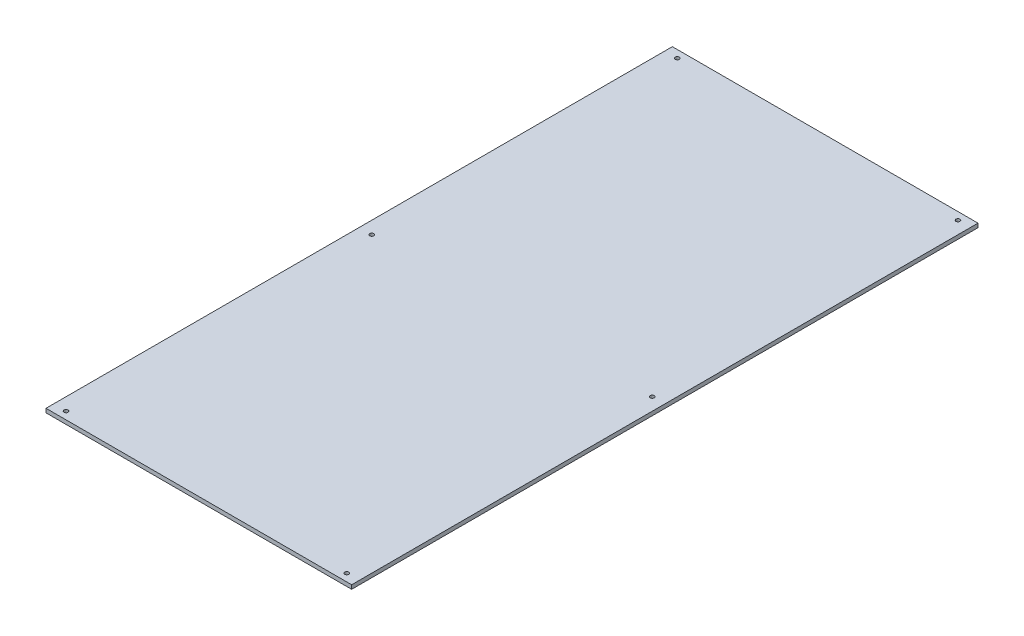
ISO-10303-21;
HEADER;
FILE_DESCRIPTION(('STEP AP214'),'2;1');
FILE_NAME('part.step','',(''),(''),'','','');
FILE_SCHEMA(('AUTOMOTIVE_DESIGN { 1 0 10303 214 1 1 1 1 }'));
ENDSEC;
DATA;
#1=APPLICATION_CONTEXT('core data for automotive mechanical design processes');
#2=APPLICATION_PROTOCOL_DEFINITION('international standard','automotive_design',2000,#1);
#3=PRODUCT_CONTEXT('',#1,'mechanical');
#4=PRODUCT('Part','Part','',(#3));
#5=PRODUCT_RELATED_PRODUCT_CATEGORY('part','',(#4));
#6=PRODUCT_DEFINITION_FORMATION('','',#4);
#7=PRODUCT_DEFINITION_CONTEXT('part definition',#1,'design');
#8=PRODUCT_DEFINITION('design','',#6,#7);
#9=PRODUCT_DEFINITION_SHAPE('','',#8);
#10=(LENGTH_UNIT() NAMED_UNIT(*) SI_UNIT(.MILLI.,.METRE.));
#11=(NAMED_UNIT(*) PLANE_ANGLE_UNIT() SI_UNIT($,.RADIAN.));
#12=(NAMED_UNIT(*) SI_UNIT($,.STERADIAN.) SOLID_ANGLE_UNIT());
#13=UNCERTAINTY_MEASURE_WITH_UNIT(LENGTH_MEASURE(1.E-05),#10,'distance_accuracy_value','');
#14=(GEOMETRIC_REPRESENTATION_CONTEXT(3) GLOBAL_UNCERTAINTY_ASSIGNED_CONTEXT((#13)) GLOBAL_UNIT_ASSIGNED_CONTEXT((#10,
#11,#12)) REPRESENTATION_CONTEXT('',''));
#15=CARTESIAN_POINT('',(0.,0.,0.));
#16=DIRECTION('',(0.,0.,1.));
#17=DIRECTION('',(1.,0.,0.));
#18=AXIS2_PLACEMENT_3D('',#15,#16,#17);
#19=CARTESIAN_POINT('',(0.,3.175,0.));
#20=DIRECTION('',(0.,-1.,0.));
#21=DIRECTION('',(0.,0.,-1.));
#22=AXIS2_PLACEMENT_3D('',#19,#20,#21);
#23=PLANE('',#22);
#24=DIRECTION('',(0.,0.,-1.));
#25=VECTOR('',#24,1.);
#26=CARTESIAN_POINT('',(122.,3.175,250.));
#27=LINE('',#26,#25);
#28=CARTESIAN_POINT('',(122.,3.175,250.));
#29=VERTEX_POINT('',#28);
#30=CARTESIAN_POINT('',(122.,3.175,-250.));
#31=VERTEX_POINT('',#30);
#32=EDGE_CURVE('E98',#29,#31,#27,.T.);
#33=ORIENTED_EDGE('',*,*,#32,.T.);
#34=DIRECTION('',(-1.,0.,0.));
#35=VECTOR('',#34,1.);
#36=CARTESIAN_POINT('',(-122.,3.175,-250.));
#37=LINE('',#36,#35);
#38=CARTESIAN_POINT('',(-122.,3.175,-250.));
#39=VERTEX_POINT('',#38);
#40=EDGE_CURVE('E93',#31,#39,#37,.T.);
#41=ORIENTED_EDGE('',*,*,#40,.T.);
#42=DIRECTION('',(0.,0.,1.));
#43=VECTOR('',#42,1.);
#44=CARTESIAN_POINT('',(-122.,3.175,250.));
#45=LINE('',#44,#43);
#46=CARTESIAN_POINT('',(-122.,3.175,250.));
#47=VERTEX_POINT('',#46);
#48=EDGE_CURVE('E96',#39,#47,#45,.T.);
#49=ORIENTED_EDGE('',*,*,#48,.T.);
#50=DIRECTION('',(1.,0.,0.));
#51=VECTOR('',#50,1.);
#52=CARTESIAN_POINT('',(-122.,3.175,250.));
#53=LINE('',#52,#51);
#54=EDGE_CURVE('E63',#47,#29,#53,.T.);
#55=ORIENTED_EDGE('',*,*,#54,.T.);
#56=EDGE_LOOP('',(#33,#41,#49,#55));
#57=FACE_BOUND('',#56,.T.);
#58=CARTESIAN_POINT('',(112.,3.175,-244.));
#59=DIRECTION('',(0.,1.,0.));
#60=DIRECTION('',(0.,0.,1.));
#61=AXIS2_PLACEMENT_3D('',#58,#59,#60);
#62=CIRCLE('',#61,1.59999999999999);
#63=CARTESIAN_POINT('',(112.,3.175,-242.4));
#64=VERTEX_POINT('',#63);
#65=EDGE_CURVE('E118',#64,#64,#62,.T.);
#66=ORIENTED_EDGE('',*,*,#65,.F.);
#67=EDGE_LOOP('',(#66));
#68=FACE_BOUND('',#67,.T.);
#69=CARTESIAN_POINT('',(112.,3.175,0.));
#70=DIRECTION('',(0.,1.,0.));
#71=DIRECTION('',(0.,0.,1.));
#72=AXIS2_PLACEMENT_3D('',#69,#70,#71);
#73=CIRCLE('',#72,1.59999999999999);
#74=CARTESIAN_POINT('',(112.,3.175,1.59999999999999));
#75=VERTEX_POINT('',#74);
#76=EDGE_CURVE('E140',#75,#75,#73,.T.);
#77=ORIENTED_EDGE('',*,*,#76,.F.);
#78=EDGE_LOOP('',(#77));
#79=FACE_BOUND('',#78,.T.);
#80=CARTESIAN_POINT('',(112.,3.175,244.));
#81=DIRECTION('',(0.,1.,0.));
#82=DIRECTION('',(0.,0.,-1.));
#83=AXIS2_PLACEMENT_3D('',#80,#81,#82);
#84=CIRCLE('',#83,1.59999999999999);
#85=CARTESIAN_POINT('',(112.,3.175,242.4));
#86=VERTEX_POINT('',#85);
#87=EDGE_CURVE('E148',#86,#86,#84,.T.);
#88=ORIENTED_EDGE('',*,*,#87,.F.);
#89=EDGE_LOOP('',(#88));
#90=FACE_BOUND('',#89,.T.);
#91=CARTESIAN_POINT('',(-112.,3.175,244.));
#92=DIRECTION('',(0.,1.,0.));
#93=DIRECTION('',(0.,0.,1.));
#94=AXIS2_PLACEMENT_3D('',#91,#92,#93);
#95=CIRCLE('',#94,1.59999999999999);
#96=CARTESIAN_POINT('',(-112.,3.175,245.6));
#97=VERTEX_POINT('',#96);
#98=EDGE_CURVE('E156',#97,#97,#95,.T.);
#99=ORIENTED_EDGE('',*,*,#98,.F.);
#100=EDGE_LOOP('',(#99));
#101=FACE_BOUND('',#100,.T.);
#102=CARTESIAN_POINT('',(-112.,3.175,0.));
#103=DIRECTION('',(0.,1.,0.));
#104=DIRECTION('',(0.,0.,-1.));
#105=AXIS2_PLACEMENT_3D('',#102,#103,#104);
#106=CIRCLE('',#105,1.59999999999999);
#107=CARTESIAN_POINT('',(-112.,3.175,-1.59999999999996));
#108=VERTEX_POINT('',#107);
#109=EDGE_CURVE('E164',#108,#108,#106,.T.);
#110=ORIENTED_EDGE('',*,*,#109,.F.);
#111=EDGE_LOOP('',(#110));
#112=FACE_BOUND('',#111,.T.);
#113=CARTESIAN_POINT('',(-112.,3.175,-244.));
#114=DIRECTION('',(0.,1.,0.));
#115=DIRECTION('',(0.,0.,-1.));
#116=AXIS2_PLACEMENT_3D('',#113,#114,#115);
#117=CIRCLE('',#116,1.59999999999999);
#118=CARTESIAN_POINT('',(-112.,3.175,-245.6));
#119=VERTEX_POINT('',#118);
#120=EDGE_CURVE('E172',#119,#119,#117,.T.);
#121=ORIENTED_EDGE('',*,*,#120,.F.);
#122=EDGE_LOOP('',(#121));
#123=FACE_BOUND('',#122,.T.);
#124=ADVANCED_FACE('F45',(#57,#68,#79,#90,#101,#112,#123),#23,.F.);
#125=CARTESIAN_POINT('',(0.,0.,0.));
#126=DIRECTION('',(0.,-1.,0.));
#127=DIRECTION('',(0.,0.,-1.));
#128=AXIS2_PLACEMENT_3D('',#125,#126,#127);
#129=PLANE('',#128);
#130=CARTESIAN_POINT('',(-112.,0.,0.));
#131=DIRECTION('',(0.,1.,0.));
#132=DIRECTION('',(0.,0.,-1.));
#133=AXIS2_PLACEMENT_3D('',#130,#131,#132);
#134=CIRCLE('',#133,1.59999999999999);
#135=CARTESIAN_POINT('',(-112.,0.,-1.59999999999996));
#136=VERTEX_POINT('',#135);
#137=EDGE_CURVE('E168',#136,#136,#134,.T.);
#138=ORIENTED_EDGE('',*,*,#137,.T.);
#139=EDGE_LOOP('',(#138));
#140=FACE_BOUND('',#139,.T.);
#141=CARTESIAN_POINT('',(112.,0.,244.));
#142=DIRECTION('',(0.,1.,0.));
#143=DIRECTION('',(0.,0.,-1.));
#144=AXIS2_PLACEMENT_3D('',#141,#142,#143);
#145=CIRCLE('',#144,1.59999999999999);
#146=CARTESIAN_POINT('',(112.,0.,242.4));
#147=VERTEX_POINT('',#146);
#148=EDGE_CURVE('E152',#147,#147,#145,.T.);
#149=ORIENTED_EDGE('',*,*,#148,.T.);
#150=EDGE_LOOP('',(#149));
#151=FACE_BOUND('',#150,.T.);
#152=CARTESIAN_POINT('',(112.,0.,-244.));
#153=DIRECTION('',(0.,1.,0.));
#154=DIRECTION('',(0.,0.,1.));
#155=AXIS2_PLACEMENT_3D('',#152,#153,#154);
#156=CIRCLE('',#155,1.59999999999999);
#157=CARTESIAN_POINT('',(112.,0.,-242.4));
#158=VERTEX_POINT('',#157);
#159=EDGE_CURVE('E136',#158,#158,#156,.T.);
#160=ORIENTED_EDGE('',*,*,#159,.T.);
#161=EDGE_LOOP('',(#160));
#162=FACE_BOUND('',#161,.T.);
#163=DIRECTION('',(0.,0.,-1.));
#164=VECTOR('',#163,1.);
#165=CARTESIAN_POINT('',(122.,0.,250.));
#166=LINE('',#165,#164);
#167=CARTESIAN_POINT('',(122.,0.,250.));
#168=VERTEX_POINT('',#167);
#169=CARTESIAN_POINT('',(122.,0.,-250.));
#170=VERTEX_POINT('',#169);
#171=EDGE_CURVE('E114',#168,#170,#166,.T.);
#172=ORIENTED_EDGE('',*,*,#171,.F.);
#173=DIRECTION('',(1.,0.,0.));
#174=VECTOR('',#173,1.);
#175=CARTESIAN_POINT('',(-122.,0.,250.));
#176=LINE('',#175,#174);
#177=CARTESIAN_POINT('',(-122.,0.,250.));
#178=VERTEX_POINT('',#177);
#179=EDGE_CURVE('E86',#178,#168,#176,.T.);
#180=ORIENTED_EDGE('',*,*,#179,.F.);
#181=DIRECTION('',(0.,0.,1.));
#182=VECTOR('',#181,1.);
#183=CARTESIAN_POINT('',(-122.,0.,250.));
#184=LINE('',#183,#182);
#185=CARTESIAN_POINT('',(-122.,0.,-250.));
#186=VERTEX_POINT('',#185);
#187=EDGE_CURVE('E80',#186,#178,#184,.T.);
#188=ORIENTED_EDGE('',*,*,#187,.F.);
#189=DIRECTION('',(-1.,0.,0.));
#190=VECTOR('',#189,1.);
#191=CARTESIAN_POINT('',(-122.,0.,-250.));
#192=LINE('',#191,#190);
#193=EDGE_CURVE('E103',#170,#186,#192,.T.);
#194=ORIENTED_EDGE('',*,*,#193,.F.);
#195=EDGE_LOOP('',(#172,#180,#188,#194));
#196=FACE_BOUND('',#195,.T.);
#197=CARTESIAN_POINT('',(112.,0.,0.));
#198=DIRECTION('',(0.,1.,0.));
#199=DIRECTION('',(0.,0.,1.));
#200=AXIS2_PLACEMENT_3D('',#197,#198,#199);
#201=CIRCLE('',#200,1.59999999999999);
#202=CARTESIAN_POINT('',(112.,0.,1.59999999999999));
#203=VERTEX_POINT('',#202);
#204=EDGE_CURVE('E144',#203,#203,#201,.T.);
#205=ORIENTED_EDGE('',*,*,#204,.T.);
#206=EDGE_LOOP('',(#205));
#207=FACE_BOUND('',#206,.T.);
#208=CARTESIAN_POINT('',(-112.,0.,244.));
#209=DIRECTION('',(0.,1.,0.));
#210=DIRECTION('',(0.,0.,1.));
#211=AXIS2_PLACEMENT_3D('',#208,#209,#210);
#212=CIRCLE('',#211,1.59999999999999);
#213=CARTESIAN_POINT('',(-112.,0.,245.6));
#214=VERTEX_POINT('',#213);
#215=EDGE_CURVE('E160',#214,#214,#212,.T.);
#216=ORIENTED_EDGE('',*,*,#215,.T.);
#217=EDGE_LOOP('',(#216));
#218=FACE_BOUND('',#217,.T.);
#219=CARTESIAN_POINT('',(-112.,0.,-244.));
#220=DIRECTION('',(0.,1.,0.));
#221=DIRECTION('',(0.,0.,-1.));
#222=AXIS2_PLACEMENT_3D('',#219,#220,#221);
#223=CIRCLE('',#222,1.59999999999999);
#224=CARTESIAN_POINT('',(-112.,0.,-245.6));
#225=VERTEX_POINT('',#224);
#226=EDGE_CURVE('E176',#225,#225,#223,.T.);
#227=ORIENTED_EDGE('',*,*,#226,.T.);
#228=EDGE_LOOP('',(#227));
#229=FACE_BOUND('',#228,.T.);
#230=ADVANCED_FACE('F131',(#140,#151,#162,#196,#207,#218,#229),#129,.T.);
#231=CARTESIAN_POINT('',(122.,3.175,250.));
#232=DIRECTION('',(-1.,0.,0.));
#233=DIRECTION('',(0.,0.,1.));
#234=AXIS2_PLACEMENT_3D('',#231,#232,#233);
#235=PLANE('',#234);
#236=ORIENTED_EDGE('',*,*,#171,.T.);
#237=DIRECTION('',(0.,-1.,0.));
#238=VECTOR('',#237,1.);
#239=CARTESIAN_POINT('',(122.,3.175,-250.));
#240=LINE('',#239,#238);
#241=EDGE_CURVE('E11',#31,#170,#240,.T.);
#242=ORIENTED_EDGE('',*,*,#241,.F.);
#243=ORIENTED_EDGE('',*,*,#32,.F.);
#244=DIRECTION('',(0.,-1.,0.));
#245=VECTOR('',#244,1.);
#246=CARTESIAN_POINT('',(122.,3.175,250.));
#247=LINE('',#246,#245);
#248=EDGE_CURVE('E110',#29,#168,#247,.T.);
#249=ORIENTED_EDGE('',*,*,#248,.T.);
#250=EDGE_LOOP('',(#236,#242,#243,#249));
#251=FACE_BOUND('',#250,.T.);
#252=ADVANCED_FACE('F47',(#251),#235,.F.);
#253=CARTESIAN_POINT('',(-122.,3.175,-250.));
#254=DIRECTION('',(0.,0.,1.));
#255=DIRECTION('',(1.,0.,0.));
#256=AXIS2_PLACEMENT_3D('',#253,#254,#255);
#257=PLANE('',#256);
#258=ORIENTED_EDGE('',*,*,#193,.T.);
#259=DIRECTION('',(0.,-1.,0.));
#260=VECTOR('',#259,1.);
#261=CARTESIAN_POINT('',(-122.,3.175,-250.));
#262=LINE('',#261,#260);
#263=EDGE_CURVE('E55',#39,#186,#262,.T.);
#264=ORIENTED_EDGE('',*,*,#263,.F.);
#265=ORIENTED_EDGE('',*,*,#40,.F.);
#266=ORIENTED_EDGE('',*,*,#241,.T.);
#267=EDGE_LOOP('',(#258,#264,#265,#266));
#268=FACE_BOUND('',#267,.T.);
#269=ADVANCED_FACE('F102',(#268),#257,.F.);
#270=CARTESIAN_POINT('',(-122.,3.175,250.));
#271=DIRECTION('',(1.,0.,0.));
#272=DIRECTION('',(0.,0.,-1.));
#273=AXIS2_PLACEMENT_3D('',#270,#271,#272);
#274=PLANE('',#273);
#275=ORIENTED_EDGE('',*,*,#187,.T.);
#276=DIRECTION('',(0.,-1.,0.));
#277=VECTOR('',#276,1.);
#278=CARTESIAN_POINT('',(-122.,3.175,250.));
#279=LINE('',#278,#277);
#280=EDGE_CURVE('E105',#47,#178,#279,.T.);
#281=ORIENTED_EDGE('',*,*,#280,.F.);
#282=ORIENTED_EDGE('',*,*,#48,.F.);
#283=ORIENTED_EDGE('',*,*,#263,.T.);
#284=EDGE_LOOP('',(#275,#281,#282,#283));
#285=FACE_BOUND('',#284,.T.);
#286=ADVANCED_FACE('F106',(#285),#274,.F.);
#287=CARTESIAN_POINT('',(-122.,3.175,250.));
#288=DIRECTION('',(0.,0.,-1.));
#289=DIRECTION('',(-1.,0.,0.));
#290=AXIS2_PLACEMENT_3D('',#287,#288,#289);
#291=PLANE('',#290);
#292=ORIENTED_EDGE('',*,*,#179,.T.);
#293=ORIENTED_EDGE('',*,*,#248,.F.);
#294=ORIENTED_EDGE('',*,*,#54,.F.);
#295=ORIENTED_EDGE('',*,*,#280,.T.);
#296=EDGE_LOOP('',(#292,#293,#294,#295));
#297=FACE_BOUND('',#296,.T.);
#298=ADVANCED_FACE('F128',(#297),#291,.F.);
#299=CARTESIAN_POINT('',(112.,3.175,-244.));
#300=DIRECTION('',(0.,-1.,0.));
#301=DIRECTION('',(0.,0.,-1.));
#302=AXIS2_PLACEMENT_3D('',#299,#300,#301);
#303=CYLINDRICAL_SURFACE('',#302,1.59999999999999);
#304=ORIENTED_EDGE('',*,*,#65,.T.);
#305=EDGE_LOOP('',(#304));
#306=FACE_BOUND('',#305,.T.);
#307=ORIENTED_EDGE('',*,*,#159,.F.);
#308=EDGE_LOOP('',(#307));
#309=FACE_BOUND('',#308,.T.);
#310=ADVANCED_FACE('F195',(#306,#309),#303,.F.);
#311=CARTESIAN_POINT('',(112.,3.175,0.));
#312=DIRECTION('',(0.,-1.,0.));
#313=DIRECTION('',(0.,0.,-1.));
#314=AXIS2_PLACEMENT_3D('',#311,#312,#313);
#315=CYLINDRICAL_SURFACE('',#314,1.59999999999999);
#316=ORIENTED_EDGE('',*,*,#76,.T.);
#317=EDGE_LOOP('',(#316));
#318=FACE_BOUND('',#317,.T.);
#319=ORIENTED_EDGE('',*,*,#204,.F.);
#320=EDGE_LOOP('',(#319));
#321=FACE_BOUND('',#320,.T.);
#322=ADVANCED_FACE('F240',(#318,#321),#315,.F.);
#323=CARTESIAN_POINT('',(112.,3.175,244.));
#324=DIRECTION('',(0.,-1.,0.));
#325=DIRECTION('',(0.,0.,-1.));
#326=AXIS2_PLACEMENT_3D('',#323,#324,#325);
#327=CYLINDRICAL_SURFACE('',#326,1.59999999999999);
#328=ORIENTED_EDGE('',*,*,#87,.T.);
#329=EDGE_LOOP('',(#328));
#330=FACE_BOUND('',#329,.T.);
#331=ORIENTED_EDGE('',*,*,#148,.F.);
#332=EDGE_LOOP('',(#331));
#333=FACE_BOUND('',#332,.T.);
#334=ADVANCED_FACE('F248',(#330,#333),#327,.F.);
#335=CARTESIAN_POINT('',(-112.,3.175,244.));
#336=DIRECTION('',(0.,-1.,0.));
#337=DIRECTION('',(0.,0.,-1.));
#338=AXIS2_PLACEMENT_3D('',#335,#336,#337);
#339=CYLINDRICAL_SURFACE('',#338,1.59999999999999);
#340=ORIENTED_EDGE('',*,*,#98,.T.);
#341=EDGE_LOOP('',(#340));
#342=FACE_BOUND('',#341,.T.);
#343=ORIENTED_EDGE('',*,*,#215,.F.);
#344=EDGE_LOOP('',(#343));
#345=FACE_BOUND('',#344,.T.);
#346=ADVANCED_FACE('F256',(#342,#345),#339,.F.);
#347=CARTESIAN_POINT('',(-112.,3.175,0.));
#348=DIRECTION('',(0.,-1.,0.));
#349=DIRECTION('',(0.,0.,-1.));
#350=AXIS2_PLACEMENT_3D('',#347,#348,#349);
#351=CYLINDRICAL_SURFACE('',#350,1.59999999999999);
#352=ORIENTED_EDGE('',*,*,#109,.T.);
#353=EDGE_LOOP('',(#352));
#354=FACE_BOUND('',#353,.T.);
#355=ORIENTED_EDGE('',*,*,#137,.F.);
#356=EDGE_LOOP('',(#355));
#357=FACE_BOUND('',#356,.T.);
#358=ADVANCED_FACE('F265',(#354,#357),#351,.F.);
#359=CARTESIAN_POINT('',(-112.,3.175,-244.));
#360=DIRECTION('',(0.,-1.,0.));
#361=DIRECTION('',(0.,0.,-1.));
#362=AXIS2_PLACEMENT_3D('',#359,#360,#361);
#363=CYLINDRICAL_SURFACE('',#362,1.59999999999999);
#364=ORIENTED_EDGE('',*,*,#120,.T.);
#365=EDGE_LOOP('',(#364));
#366=FACE_BOUND('',#365,.T.);
#367=ORIENTED_EDGE('',*,*,#226,.F.);
#368=EDGE_LOOP('',(#367));
#369=FACE_BOUND('',#368,.T.);
#370=ADVANCED_FACE('F184',(#366,#369),#363,.F.);
#371=CLOSED_SHELL('',(#124,#230,#252,#269,#286,#298,#310,#322,#334,#346,#358,#370));
#372=MANIFOLD_SOLID_BREP('B2',#371);
#373=ADVANCED_BREP_SHAPE_REPRESENTATION('',(#18,#372),#14);
#374=SHAPE_DEFINITION_REPRESENTATION(#9,#373);
ENDSEC;
END-ISO-10303-21;
